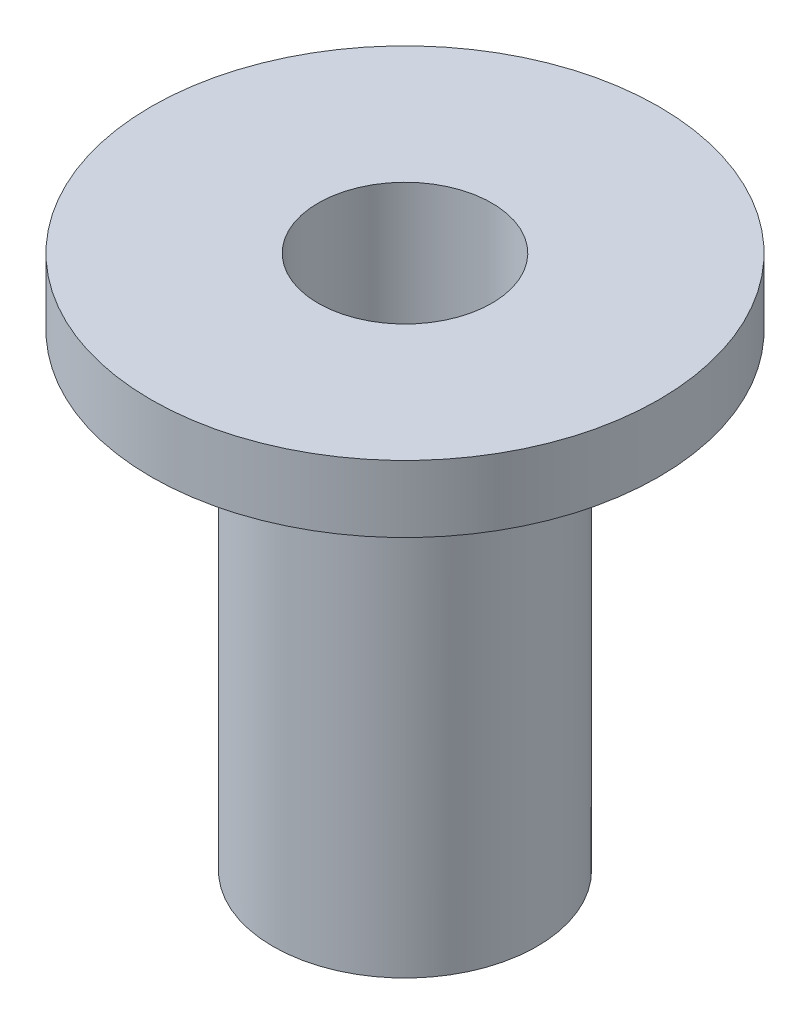
ISO-10303-21;
HEADER;
FILE_DESCRIPTION(('STEP AP214'),'2;1');
FILE_NAME('part.step','',(''),(''),'','','');
FILE_SCHEMA(('AUTOMOTIVE_DESIGN { 1 0 10303 214 1 1 1 1 }'));
ENDSEC;
DATA;
#1=APPLICATION_CONTEXT('core data for automotive mechanical design processes');
#2=APPLICATION_PROTOCOL_DEFINITION('international standard','automotive_design',2000,#1);
#3=PRODUCT_CONTEXT('',#1,'mechanical');
#4=PRODUCT('Part','Part','',(#3));
#5=PRODUCT_RELATED_PRODUCT_CATEGORY('part','',(#4));
#6=PRODUCT_DEFINITION_FORMATION('','',#4);
#7=PRODUCT_DEFINITION_CONTEXT('part definition',#1,'design');
#8=PRODUCT_DEFINITION('design','',#6,#7);
#9=PRODUCT_DEFINITION_SHAPE('','',#8);
#10=(LENGTH_UNIT() NAMED_UNIT(*) SI_UNIT(.MILLI.,.METRE.));
#11=(NAMED_UNIT(*) PLANE_ANGLE_UNIT() SI_UNIT($,.RADIAN.));
#12=(NAMED_UNIT(*) SI_UNIT($,.STERADIAN.) SOLID_ANGLE_UNIT());
#13=UNCERTAINTY_MEASURE_WITH_UNIT(LENGTH_MEASURE(1.E-05),#10,'distance_accuracy_value','');
#14=(GEOMETRIC_REPRESENTATION_CONTEXT(3) GLOBAL_UNCERTAINTY_ASSIGNED_CONTEXT((#13)) GLOBAL_UNIT_ASSIGNED_CONTEXT((#10,
#11,#12)) REPRESENTATION_CONTEXT('',''));
#15=CARTESIAN_POINT('',(0.,0.,0.));
#16=DIRECTION('',(0.,0.,1.));
#17=DIRECTION('',(1.,0.,0.));
#18=AXIS2_PLACEMENT_3D('',#15,#16,#17);
#19=CARTESIAN_POINT('',(-3.95,0.,0.));
#20=DIRECTION('',(0.,-1.,0.));
#21=DIRECTION('',(0.,0.,-1.));
#22=AXIS2_PLACEMENT_3D('',#19,#20,#21);
#23=PLANE('',#22);
#24=CARTESIAN_POINT('',(0.,0.,0.));
#25=DIRECTION('',(0.,1.,0.));
#26=DIRECTION('',(0.,0.,1.));
#27=AXIS2_PLACEMENT_3D('',#24,#25,#26);
#28=CIRCLE('',#27,2.6);
#29=CARTESIAN_POINT('',(0.,0.,2.6));
#30=VERTEX_POINT('',#29);
#31=EDGE_CURVE('E48',#30,#30,#28,.T.);
#32=ORIENTED_EDGE('',*,*,#31,.T.);
#33=EDGE_LOOP('',(#32));
#34=FACE_BOUND('',#33,.T.);
#35=CARTESIAN_POINT('',(0.,0.,0.));
#36=DIRECTION('',(0.,1.,0.));
#37=DIRECTION('',(0.,0.,1.));
#38=AXIS2_PLACEMENT_3D('',#35,#36,#37);
#39=CIRCLE('',#38,3.95);
#40=CARTESIAN_POINT('',(0.,0.,3.95));
#41=VERTEX_POINT('',#40);
#42=EDGE_CURVE('E63',#41,#41,#39,.T.);
#43=ORIENTED_EDGE('',*,*,#42,.F.);
#44=EDGE_LOOP('',(#43));
#45=FACE_BOUND('',#44,.T.);
#46=ADVANCED_FACE('F36',(#34,#45),#23,.T.);
#47=CARTESIAN_POINT('',(0.,5.17341155810984,0.));
#48=DIRECTION('',(0.,1.,0.));
#49=DIRECTION('',(0.,0.,1.));
#50=AXIS2_PLACEMENT_3D('',#47,#48,#49);
#51=CYLINDRICAL_SURFACE('',#50,2.6);
#52=CARTESIAN_POINT('',(0.,16.,0.));
#53=DIRECTION('',(0.,1.,0.));
#54=DIRECTION('',(0.,0.,1.));
#55=AXIS2_PLACEMENT_3D('',#52,#53,#54);
#56=CIRCLE('',#55,2.6);
#57=CARTESIAN_POINT('',(0.,16.,2.6));
#58=VERTEX_POINT('',#57);
#59=EDGE_CURVE('E52',#58,#58,#56,.T.);
#60=ORIENTED_EDGE('',*,*,#59,.T.);
#61=EDGE_LOOP('',(#60));
#62=FACE_BOUND('',#61,.T.);
#63=ORIENTED_EDGE('',*,*,#31,.F.);
#64=EDGE_LOOP('',(#63));
#65=FACE_BOUND('',#64,.T.);
#66=ADVANCED_FACE('F70',(#62,#65),#51,.F.);
#67=CARTESIAN_POINT('',(-2.6,16.,0.));
#68=DIRECTION('',(0.,1.,0.));
#69=DIRECTION('',(0.,0.,1.));
#70=AXIS2_PLACEMENT_3D('',#67,#68,#69);
#71=PLANE('',#70);
#72=CARTESIAN_POINT('',(0.,16.,0.));
#73=DIRECTION('',(0.,1.,0.));
#74=DIRECTION('',(0.,0.,1.));
#75=AXIS2_PLACEMENT_3D('',#72,#73,#74);
#76=CIRCLE('',#75,7.6);
#77=CARTESIAN_POINT('',(0.,16.,7.6));
#78=VERTEX_POINT('',#77);
#79=EDGE_CURVE('E57',#78,#78,#76,.T.);
#80=ORIENTED_EDGE('',*,*,#79,.T.);
#81=EDGE_LOOP('',(#80));
#82=FACE_BOUND('',#81,.T.);
#83=ORIENTED_EDGE('',*,*,#59,.F.);
#84=EDGE_LOOP('',(#83));
#85=FACE_BOUND('',#84,.T.);
#86=ADVANCED_FACE('F75',(#82,#85),#71,.T.);
#87=CARTESIAN_POINT('',(0.,5.17341155810984,0.));
#88=DIRECTION('',(0.,1.,0.));
#89=DIRECTION('',(0.,0.,1.));
#90=AXIS2_PLACEMENT_3D('',#87,#88,#89);
#91=CYLINDRICAL_SURFACE('',#90,7.6);
#92=CARTESIAN_POINT('',(0.,14.,0.));
#93=DIRECTION('',(0.,1.,0.));
#94=DIRECTION('',(0.,0.,1.));
#95=AXIS2_PLACEMENT_3D('',#92,#93,#94);
#96=CIRCLE('',#95,7.6);
#97=CARTESIAN_POINT('',(0.,14.,7.6));
#98=VERTEX_POINT('',#97);
#99=EDGE_CURVE('E60',#98,#98,#96,.T.);
#100=ORIENTED_EDGE('',*,*,#99,.T.);
#101=EDGE_LOOP('',(#100));
#102=FACE_BOUND('',#101,.T.);
#103=ORIENTED_EDGE('',*,*,#79,.F.);
#104=EDGE_LOOP('',(#103));
#105=FACE_BOUND('',#104,.T.);
#106=ADVANCED_FACE('F81',(#102,#105),#91,.T.);
#107=CARTESIAN_POINT('',(-7.6,14.,0.));
#108=DIRECTION('',(0.,-1.,0.));
#109=DIRECTION('',(0.,0.,-1.));
#110=AXIS2_PLACEMENT_3D('',#107,#108,#109);
#111=PLANE('',#110);
#112=CARTESIAN_POINT('',(0.,14.,0.));
#113=DIRECTION('',(0.,-1.,0.));
#114=DIRECTION('',(0.,0.,-1.));
#115=AXIS2_PLACEMENT_3D('',#112,#113,#114);
#116=CIRCLE('',#115,4.45000000000001);
#117=CARTESIAN_POINT('',(0.,14.,-4.45000000000001));
#118=VERTEX_POINT('',#117);
#119=EDGE_CURVE('E44',#118,#118,#116,.F.);
#120=ORIENTED_EDGE('',*,*,#119,.T.);
#121=EDGE_LOOP('',(#120));
#122=FACE_BOUND('',#121,.T.);
#123=ORIENTED_EDGE('',*,*,#99,.F.);
#124=EDGE_LOOP('',(#123));
#125=FACE_BOUND('',#124,.T.);
#126=ADVANCED_FACE('F85',(#122,#125),#111,.T.);
#127=CARTESIAN_POINT('',(0.,5.17341155810984,0.));
#128=DIRECTION('',(0.,1.,0.));
#129=DIRECTION('',(0.,0.,1.));
#130=AXIS2_PLACEMENT_3D('',#127,#128,#129);
#131=CYLINDRICAL_SURFACE('',#130,3.95);
#132=CARTESIAN_POINT('',(0.,13.5,0.));
#133=DIRECTION('',(0.,-1.,0.));
#134=DIRECTION('',(0.,0.,-1.));
#135=AXIS2_PLACEMENT_3D('',#132,#133,#134);
#136=CIRCLE('',#135,3.95);
#137=CARTESIAN_POINT('',(0.,13.5,-3.95));
#138=VERTEX_POINT('',#137);
#139=EDGE_CURVE('E10',#138,#138,#136,.T.);
#140=ORIENTED_EDGE('',*,*,#139,.T.);
#141=EDGE_LOOP('',(#140));
#142=FACE_BOUND('',#141,.T.);
#143=ORIENTED_EDGE('',*,*,#42,.T.);
#144=EDGE_LOOP('',(#143));
#145=FACE_BOUND('',#144,.T.);
#146=ADVANCED_FACE('F67',(#142,#145),#131,.T.);
#147=CARTESIAN_POINT('',(0.,14.,0.));
#148=DIRECTION('',(0.,1.,0.));
#149=DIRECTION('',(0.,0.,1.));
#150=AXIS2_PLACEMENT_3D('',#147,#148,#149);
#151=CONICAL_SURFACE('',#150,4.45000000000001,0.785398163397452);
#152=ORIENTED_EDGE('',*,*,#139,.F.);
#153=EDGE_LOOP('',(#152));
#154=FACE_BOUND('',#153,.T.);
#155=ORIENTED_EDGE('',*,*,#119,.F.);
#156=EDGE_LOOP('',(#155));
#157=FACE_BOUND('',#156,.T.);
#158=ADVANCED_FACE('F39',(#154,#157),#151,.T.);
#159=CLOSED_SHELL('',(#46,#66,#86,#106,#126,#146,#158));
#160=MANIFOLD_SOLID_BREP('B2',#159);
#161=ADVANCED_BREP_SHAPE_REPRESENTATION('',(#18,#160),#14);
#162=SHAPE_DEFINITION_REPRESENTATION(#9,#161);
ENDSEC;
END-ISO-10303-21;
